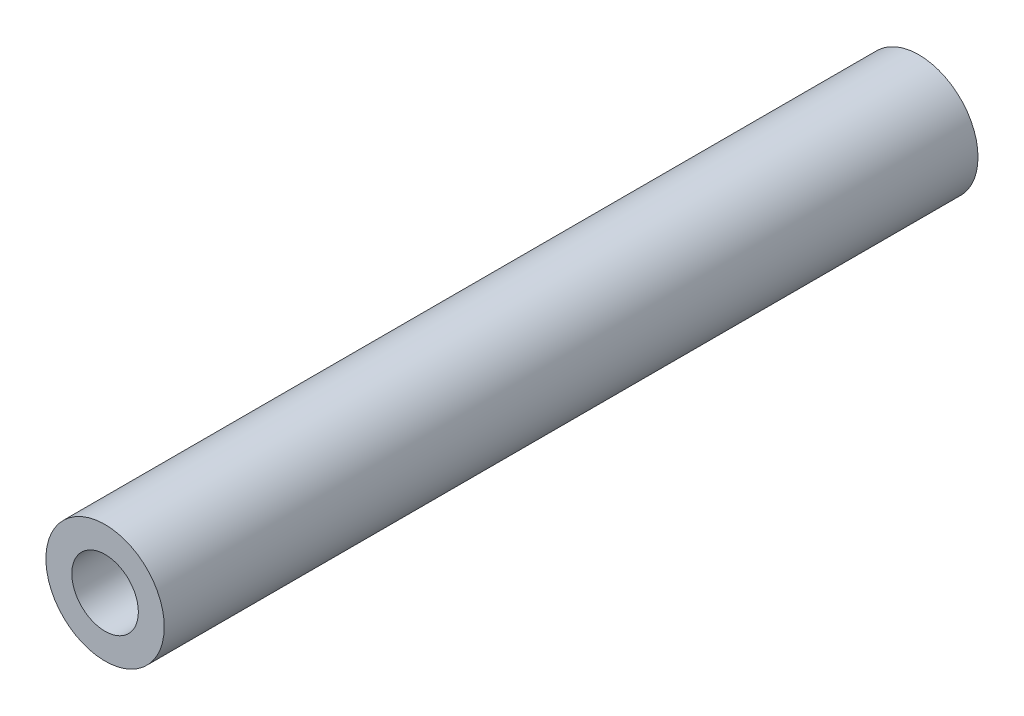
ISO-10303-21;
HEADER;
FILE_DESCRIPTION(('STEP AP214'),'2;1');
FILE_NAME('part.step','',(''),(''),'','','');
FILE_SCHEMA(('AUTOMOTIVE_DESIGN { 1 0 10303 214 1 1 1 1 }'));
ENDSEC;
DATA;
#1=APPLICATION_CONTEXT('core data for automotive mechanical design processes');
#2=APPLICATION_PROTOCOL_DEFINITION('international standard','automotive_design',2000,#1);
#3=PRODUCT_CONTEXT('',#1,'mechanical');
#4=PRODUCT('Part','Part','',(#3));
#5=PRODUCT_RELATED_PRODUCT_CATEGORY('part','',(#4));
#6=PRODUCT_DEFINITION_FORMATION('','',#4);
#7=PRODUCT_DEFINITION_CONTEXT('part definition',#1,'design');
#8=PRODUCT_DEFINITION('design','',#6,#7);
#9=PRODUCT_DEFINITION_SHAPE('','',#8);
#10=(LENGTH_UNIT() NAMED_UNIT(*) SI_UNIT(.MILLI.,.METRE.));
#11=(NAMED_UNIT(*) PLANE_ANGLE_UNIT() SI_UNIT($,.RADIAN.));
#12=(NAMED_UNIT(*) SI_UNIT($,.STERADIAN.) SOLID_ANGLE_UNIT());
#13=UNCERTAINTY_MEASURE_WITH_UNIT(LENGTH_MEASURE(1.E-05),#10,'distance_accuracy_value','');
#14=(GEOMETRIC_REPRESENTATION_CONTEXT(3) GLOBAL_UNCERTAINTY_ASSIGNED_CONTEXT((#13)) GLOBAL_UNIT_ASSIGNED_CONTEXT((#10,
#11,#12)) REPRESENTATION_CONTEXT('',''));
#15=CARTESIAN_POINT('',(0.,0.,0.));
#16=DIRECTION('',(0.,0.,1.));
#17=DIRECTION('',(1.,0.,0.));
#18=AXIS2_PLACEMENT_3D('',#15,#16,#17);
#19=CARTESIAN_POINT('',(0.,0.,28.));
#20=DIRECTION('',(0.,0.,1.));
#21=DIRECTION('',(1.,0.,0.));
#22=AXIS2_PLACEMENT_3D('',#19,#20,#21);
#23=PLANE('',#22);
#24=CARTESIAN_POINT('',(0.,0.,28.));
#25=DIRECTION('',(0.,0.,1.));
#26=DIRECTION('',(1.,0.,0.));
#27=AXIS2_PLACEMENT_3D('',#24,#25,#26);
#28=CIRCLE('',#27,4.);
#29=CARTESIAN_POINT('',(4.,0.,28.));
#30=VERTEX_POINT('',#29);
#31=EDGE_CURVE('E10',#30,#30,#28,.T.);
#32=ORIENTED_EDGE('',*,*,#31,.T.);
#33=EDGE_LOOP('',(#32));
#34=FACE_BOUND('',#33,.T.);
#35=CARTESIAN_POINT('',(0.,0.,28.));
#36=DIRECTION('',(0.,0.,1.));
#37=DIRECTION('',(1.,0.,0.));
#38=AXIS2_PLACEMENT_3D('',#35,#36,#37);
#39=CIRCLE('',#38,2.25);
#40=CARTESIAN_POINT('',(2.25,0.,28.));
#41=VERTEX_POINT('',#40);
#42=EDGE_CURVE('E50',#41,#41,#39,.T.);
#43=ORIENTED_EDGE('',*,*,#42,.F.);
#44=EDGE_LOOP('',(#43));
#45=FACE_BOUND('',#44,.T.);
#46=ADVANCED_FACE('F36',(#34,#45),#23,.T.);
#47=CARTESIAN_POINT('',(0.,0.,-27.));
#48=DIRECTION('',(0.,0.,1.));
#49=DIRECTION('',(1.,0.,0.));
#50=AXIS2_PLACEMENT_3D('',#47,#48,#49);
#51=PLANE('',#50);
#52=CARTESIAN_POINT('',(0.,0.,-27.));
#53=DIRECTION('',(0.,0.,1.));
#54=DIRECTION('',(1.,0.,0.));
#55=AXIS2_PLACEMENT_3D('',#52,#53,#54);
#56=CIRCLE('',#55,4.);
#57=CARTESIAN_POINT('',(4.,0.,-27.));
#58=VERTEX_POINT('',#57);
#59=EDGE_CURVE('E40',#58,#58,#56,.T.);
#60=ORIENTED_EDGE('',*,*,#59,.F.);
#61=EDGE_LOOP('',(#60));
#62=FACE_BOUND('',#61,.T.);
#63=CARTESIAN_POINT('',(0.,0.,-27.));
#64=DIRECTION('',(0.,0.,1.));
#65=DIRECTION('',(1.,0.,0.));
#66=AXIS2_PLACEMENT_3D('',#63,#64,#65);
#67=CIRCLE('',#66,2.25);
#68=CARTESIAN_POINT('',(2.25,0.,-27.));
#69=VERTEX_POINT('',#68);
#70=EDGE_CURVE('E52',#69,#69,#67,.T.);
#71=ORIENTED_EDGE('',*,*,#70,.T.);
#72=EDGE_LOOP('',(#71));
#73=FACE_BOUND('',#72,.T.);
#74=ADVANCED_FACE('F63',(#62,#73),#51,.F.);
#75=CARTESIAN_POINT('',(0.,0.,28.));
#76=DIRECTION('',(0.,0.,-1.));
#77=DIRECTION('',(-1.,0.,0.));
#78=AXIS2_PLACEMENT_3D('',#75,#76,#77);
#79=CYLINDRICAL_SURFACE('',#78,4.);
#80=ORIENTED_EDGE('',*,*,#31,.F.);
#81=EDGE_LOOP('',(#80));
#82=FACE_BOUND('',#81,.T.);
#83=ORIENTED_EDGE('',*,*,#59,.T.);
#84=EDGE_LOOP('',(#83));
#85=FACE_BOUND('',#84,.T.);
#86=ADVANCED_FACE('F38',(#82,#85),#79,.T.);
#87=CARTESIAN_POINT('',(0.,0.,28.));
#88=DIRECTION('',(0.,0.,-1.));
#89=DIRECTION('',(-1.,0.,0.));
#90=AXIS2_PLACEMENT_3D('',#87,#88,#89);
#91=CYLINDRICAL_SURFACE('',#90,2.25);
#92=ORIENTED_EDGE('',*,*,#42,.T.);
#93=EDGE_LOOP('',(#92));
#94=FACE_BOUND('',#93,.T.);
#95=ORIENTED_EDGE('',*,*,#70,.F.);
#96=EDGE_LOOP('',(#95));
#97=FACE_BOUND('',#96,.T.);
#98=ADVANCED_FACE('F59',(#94,#97),#91,.F.);
#99=CLOSED_SHELL('',(#46,#74,#86,#98));
#100=MANIFOLD_SOLID_BREP('B2',#99);
#101=ADVANCED_BREP_SHAPE_REPRESENTATION('',(#18,#100),#14);
#102=SHAPE_DEFINITION_REPRESENTATION(#9,#101);
ENDSEC;
END-ISO-10303-21;
